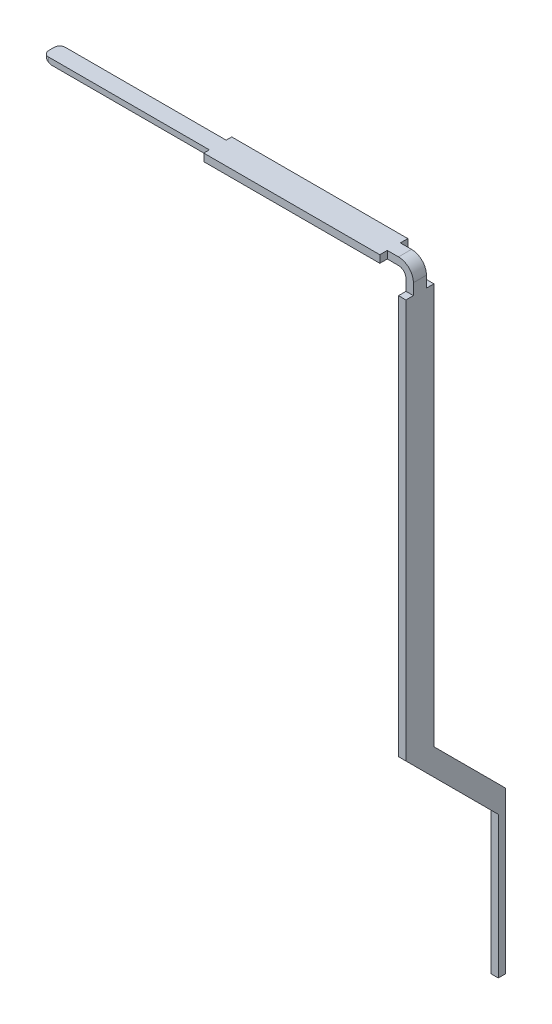
ISO-10303-21;
HEADER;
FILE_DESCRIPTION(('STEP AP214'),'2;1');
FILE_NAME('part.step','',(''),(''),'','','');
FILE_SCHEMA(('AUTOMOTIVE_DESIGN { 1 0 10303 214 1 1 1 1 }'));
ENDSEC;
DATA;
#1=APPLICATION_CONTEXT('core data for automotive mechanical design processes');
#2=APPLICATION_PROTOCOL_DEFINITION('international standard','automotive_design',2000,#1);
#3=PRODUCT_CONTEXT('',#1,'mechanical');
#4=PRODUCT('Part','Part','',(#3));
#5=PRODUCT_RELATED_PRODUCT_CATEGORY('part','',(#4));
#6=PRODUCT_DEFINITION_FORMATION('','',#4);
#7=PRODUCT_DEFINITION_CONTEXT('part definition',#1,'design');
#8=PRODUCT_DEFINITION('design','',#6,#7);
#9=PRODUCT_DEFINITION_SHAPE('','',#8);
#10=(LENGTH_UNIT() NAMED_UNIT(*) SI_UNIT(.MILLI.,.METRE.));
#11=(NAMED_UNIT(*) PLANE_ANGLE_UNIT() SI_UNIT($,.RADIAN.));
#12=(NAMED_UNIT(*) SI_UNIT($,.STERADIAN.) SOLID_ANGLE_UNIT());
#13=UNCERTAINTY_MEASURE_WITH_UNIT(LENGTH_MEASURE(1.E-05),#10,'distance_accuracy_value','');
#14=(GEOMETRIC_REPRESENTATION_CONTEXT(3) GLOBAL_UNCERTAINTY_ASSIGNED_CONTEXT((#13)) GLOBAL_UNIT_ASSIGNED_CONTEXT((#10,
#11,#12)) REPRESENTATION_CONTEXT('',''));
#15=CARTESIAN_POINT('',(0.,0.,0.));
#16=DIRECTION('',(0.,0.,1.));
#17=DIRECTION('',(1.,0.,0.));
#18=AXIS2_PLACEMENT_3D('',#15,#16,#17);
#19=CARTESIAN_POINT('',(7.71,11.7056,-3.5715));
#20=DIRECTION('',(1.,0.,0.));
#21=DIRECTION('',(0.,1.,0.));
#22=AXIS2_PLACEMENT_3D('',#19,#20,#21);
#23=PLANE('',#22);
#24=DIRECTION('',(0.,1.,0.));
#25=VECTOR('',#24,1.);
#26=CARTESIAN_POINT('',(7.71,11.7056,-4.37499999999994));
#27=LINE('',#26,#25);
#28=CARTESIAN_POINT('',(7.71,0.31210678118785,-4.37499999999953));
#29=VERTEX_POINT('',#28);
#30=CARTESIAN_POINT('',(7.71,11.060000000001,-4.375));
#31=VERTEX_POINT('',#30);
#32=EDGE_CURVE('E11',#29,#31,#27,.T.);
#33=ORIENTED_EDGE('',*,*,#32,.T.);
#34=DIRECTION('',(0.,0.,1.));
#35=VECTOR('',#34,1.);
#36=CARTESIAN_POINT('',(7.71,11.06,-3.5715));
#37=LINE('',#36,#35);
#38=CARTESIAN_POINT('',(7.71,11.06,-4.175));
#39=VERTEX_POINT('',#38);
#40=EDGE_CURVE('E27',#31,#39,#37,.T.);
#41=ORIENTED_EDGE('',*,*,#40,.T.);
#42=DIRECTION('',(0.,1.,0.));
#43=VECTOR('',#42,1.);
#44=CARTESIAN_POINT('',(7.71,11.7056,-4.175));
#45=LINE('',#44,#43);
#46=CARTESIAN_POINT('',(7.71,11.359999999999,-4.17500000000005));
#47=VERTEX_POINT('',#46);
#48=EDGE_CURVE('E420',#39,#47,#45,.T.);
#49=ORIENTED_EDGE('',*,*,#48,.T.);
#50=DIRECTION('',(0.,0.,1.));
#51=VECTOR('',#50,1.);
#52=CARTESIAN_POINT('',(7.71,11.3599999999979,-3.5715));
#53=LINE('',#52,#51);
#54=CARTESIAN_POINT('',(7.71,11.359999999999,-3.82499999999995));
#55=VERTEX_POINT('',#54);
#56=EDGE_CURVE('E416',#47,#55,#53,.T.);
#57=ORIENTED_EDGE('',*,*,#56,.T.);
#58=DIRECTION('',(0.,-1.,0.));
#59=VECTOR('',#58,1.);
#60=CARTESIAN_POINT('',(7.71,11.7056,-3.82499999999995));
#61=LINE('',#60,#59);
#62=CARTESIAN_POINT('',(7.71,11.0600000000005,-3.825));
#63=VERTEX_POINT('',#62);
#64=EDGE_CURVE('E421',#55,#63,#61,.T.);
#65=ORIENTED_EDGE('',*,*,#64,.T.);
#66=DIRECTION('',(0.,0.,1.));
#67=VECTOR('',#66,1.);
#68=CARTESIAN_POINT('',(7.71,11.060000000001,-3.5715));
#69=LINE('',#68,#67);
#70=CARTESIAN_POINT('',(7.71,11.0600000000003,-3.625));
#71=VERTEX_POINT('',#70);
#72=EDGE_CURVE('E437',#63,#71,#69,.T.);
#73=ORIENTED_EDGE('',*,*,#72,.T.);
#74=DIRECTION('',(0.,-1.,0.));
#75=VECTOR('',#74,1.);
#76=CARTESIAN_POINT('',(7.71,11.7056,-3.625));
#77=LINE('',#76,#75);
#78=CARTESIAN_POINT('',(7.71,0.355000000000092,-3.62499999999995));
#79=VERTEX_POINT('',#78);
#80=EDGE_CURVE('E20',#71,#79,#77,.T.);
#81=ORIENTED_EDGE('',*,*,#80,.T.);
#82=DIRECTION('',(0.,-0.707106781186548,-0.707106781186548));
#83=VECTOR('',#82,1.);
#84=CARTESIAN_POINT('',(7.71,0.355000000000083,-3.62499999999992));
#85=LINE('',#84,#83);
#86=CARTESIAN_POINT('',(7.71,-2.12000000000008,-6.1));
#87=VERTEX_POINT('',#86);
#88=EDGE_CURVE('E282',#79,#87,#85,.T.);
#89=ORIENTED_EDGE('',*,*,#88,.T.);
#90=DIRECTION('',(0.,-1.,0.));
#91=VECTOR('',#90,1.);
#92=CARTESIAN_POINT('',(7.71,11.7056,-6.10000000000008));
#93=LINE('',#92,#91);
#94=CARTESIAN_POINT('',(7.71,-5.92,-6.1));
#95=VERTEX_POINT('',#94);
#96=EDGE_CURVE('E271',#87,#95,#93,.T.);
#97=ORIENTED_EDGE('',*,*,#96,.T.);
#98=DIRECTION('',(0.,0.,-1.));
#99=VECTOR('',#98,1.);
#100=CARTESIAN_POINT('',(7.71,-5.92,-3.5715));
#101=LINE('',#100,#99);
#102=CARTESIAN_POINT('',(7.71,-5.92,-6.3));
#103=VERTEX_POINT('',#102);
#104=EDGE_CURVE('E384',#95,#103,#101,.T.);
#105=ORIENTED_EDGE('',*,*,#104,.T.);
#106=DIRECTION('',(0.,1.,0.));
#107=VECTOR('',#106,1.);
#108=CARTESIAN_POINT('',(7.71,11.7056,-6.3));
#109=LINE('',#108,#107);
#110=CARTESIAN_POINT('',(7.71,-1.61289321881287,-6.3));
#111=VERTEX_POINT('',#110);
#112=EDGE_CURVE('E380',#103,#111,#109,.T.);
#113=ORIENTED_EDGE('',*,*,#112,.T.);
#114=DIRECTION('',(0.,0.707106781186725,0.70710678118637));
#115=VECTOR('',#114,1.);
#116=CARTESIAN_POINT('',(7.71,-1.61289321881282,-6.3));
#117=LINE('',#116,#115);
#118=EDGE_CURVE('E318',#111,#29,#117,.T.);
#119=ORIENTED_EDGE('',*,*,#118,.T.);
#120=EDGE_LOOP('',(#33,#41,#49,#57,#65,#73,#81,#89,#97,#105,#113,#119));
#121=FACE_BOUND('',#120,.T.);
#122=ADVANCED_FACE('F16',(#121),#23,.T.);
#123=CARTESIAN_POINT('',(7.735730373025,11.06,-4.149269626975));
#124=DIRECTION('',(0.,1.,0.));
#125=DIRECTION('',(1.,0.,0.));
#126=AXIS2_PLACEMENT_3D('',#123,#124,#125);
#127=PLANE('',#126);
#128=DIRECTION('',(0.,0.,1.));
#129=VECTOR('',#128,1.);
#130=CARTESIAN_POINT('',(7.51,11.060000000002,-3.5715));
#131=LINE('',#130,#129);
#132=CARTESIAN_POINT('',(7.51,11.060000000002,-4.375));
#133=VERTEX_POINT('',#132);
#134=CARTESIAN_POINT('',(7.51,11.0600000000011,-4.175));
#135=VERTEX_POINT('',#134);
#136=EDGE_CURVE('E303',#133,#135,#131,.T.);
#137=ORIENTED_EDGE('',*,*,#136,.T.);
#138=DIRECTION('',(1.,0.,0.));
#139=VECTOR('',#138,1.);
#140=CARTESIAN_POINT('',(7.735730373025,11.06,-4.175));
#141=LINE('',#140,#139);
#142=EDGE_CURVE('E294',#135,#39,#141,.T.);
#143=ORIENTED_EDGE('',*,*,#142,.T.);
#144=ORIENTED_EDGE('',*,*,#40,.F.);
#145=DIRECTION('',(-1.,0.,0.));
#146=VECTOR('',#145,1.);
#147=CARTESIAN_POINT('',(7.735730373025,11.06,-4.375));
#148=LINE('',#147,#146);
#149=EDGE_CURVE('E300',#31,#133,#148,.T.);
#150=ORIENTED_EDGE('',*,*,#149,.T.);
#151=EDGE_LOOP('',(#137,#143,#144,#150));
#152=FACE_BOUND('',#151,.T.);
#153=ADVANCED_FACE('F302',(#152),#127,.T.);
#154=CARTESIAN_POINT('',(7.735730373025,11.27495786438,-4.375));
#155=DIRECTION('',(0.,0.,-1.));
#156=DIRECTION('',(0.,-1.,0.));
#157=AXIS2_PLACEMENT_3D('',#154,#155,#156);
#158=PLANE('',#157);
#159=ORIENTED_EDGE('',*,*,#149,.F.);
#160=ORIENTED_EDGE('',*,*,#32,.F.);
#161=DIRECTION('',(-1.,0.,0.));
#162=VECTOR('',#161,1.);
#163=CARTESIAN_POINT('',(7.735730373025,0.312106781188277,-4.375));
#164=LINE('',#163,#162);
#165=CARTESIAN_POINT('',(7.51,0.312106781187388,-4.37499999999954));
#166=VERTEX_POINT('',#165);
#167=EDGE_CURVE('E309',#29,#166,#164,.T.);
#168=ORIENTED_EDGE('',*,*,#167,.T.);
#169=DIRECTION('',(0.,1.,0.));
#170=VECTOR('',#169,1.);
#171=CARTESIAN_POINT('',(7.51,11.27495786438,-4.375));
#172=LINE('',#171,#170);
#173=EDGE_CURVE('E313',#166,#133,#172,.T.);
#174=ORIENTED_EDGE('',*,*,#173,.T.);
#175=EDGE_LOOP('',(#159,#160,#168,#174));
#176=FACE_BOUND('',#175,.T.);
#177=ADVANCED_FACE('F320',(#176),#158,.T.);
#178=CARTESIAN_POINT('',(7.735730373025,-1.651393218813,-6.3385));
#179=DIRECTION('',(0.,-0.707106781186636,0.707106781186459));
#180=DIRECTION('',(-1.,0.,0.));
#181=AXIS2_PLACEMENT_3D('',#178,#179,#180);
#182=PLANE('',#181);
#183=DIRECTION('',(1.,0.,0.));
#184=VECTOR('',#183,1.);
#185=CARTESIAN_POINT('',(7.735730373025,-1.61289321881313,-6.30000000000012));
#186=LINE('',#185,#184);
#187=CARTESIAN_POINT('',(7.51,-1.61289321881299,-6.3));
#188=VERTEX_POINT('',#187);
#189=EDGE_CURVE('E324',#188,#111,#186,.T.);
#190=ORIENTED_EDGE('',*,*,#189,.F.);
#191=DIRECTION('',(0.,-0.707106781186459,-0.707106781186636));
#192=VECTOR('',#191,1.);
#193=CARTESIAN_POINT('',(7.51,-1.651393218813,-6.3385));
#194=LINE('',#193,#192);
#195=EDGE_CURVE('E385',#166,#188,#194,.T.);
#196=ORIENTED_EDGE('',*,*,#195,.F.);
#197=ORIENTED_EDGE('',*,*,#167,.F.);
#198=ORIENTED_EDGE('',*,*,#118,.F.);
#199=EDGE_LOOP('',(#190,#196,#197,#198));
#200=FACE_BOUND('',#199,.T.);
#201=ADVANCED_FACE('F1096',(#200),#182,.F.);
#202=CARTESIAN_POINT('',(7.735730373025,-6.006142135624,-6.3));
#203=DIRECTION('',(0.,0.,1.));
#204=DIRECTION('',(1.,0.,0.));
#205=AXIS2_PLACEMENT_3D('',#202,#203,#204);
#206=PLANE('',#205);
#207=DIRECTION('',(1.,0.,0.));
#208=VECTOR('',#207,1.);
#209=CARTESIAN_POINT('',(7.735730373025,-5.92,-6.3));
#210=LINE('',#209,#208);
#211=CARTESIAN_POINT('',(7.51,-5.92,-6.3));
#212=VERTEX_POINT('',#211);
#213=EDGE_CURVE('E333',#212,#103,#210,.T.);
#214=ORIENTED_EDGE('',*,*,#213,.F.);
#215=DIRECTION('',(0.,-1.,0.));
#216=VECTOR('',#215,1.);
#217=CARTESIAN_POINT('',(7.51,-6.006142135624,-6.3));
#218=LINE('',#217,#216);
#219=EDGE_CURVE('E388',#188,#212,#218,.T.);
#220=ORIENTED_EDGE('',*,*,#219,.F.);
#221=ORIENTED_EDGE('',*,*,#189,.T.);
#222=ORIENTED_EDGE('',*,*,#112,.F.);
#223=EDGE_LOOP('',(#214,#220,#221,#222));
#224=FACE_BOUND('',#223,.T.);
#225=ADVANCED_FACE('F1229',(#224),#206,.F.);
#226=CARTESIAN_POINT('',(7.735730373025,-5.92,-6.074269626975));
#227=DIRECTION('',(0.,1.,0.));
#228=DIRECTION('',(1.,0.,0.));
#229=AXIS2_PLACEMENT_3D('',#226,#227,#228);
#230=PLANE('',#229);
#231=ORIENTED_EDGE('',*,*,#104,.F.);
#232=DIRECTION('',(1.,0.,0.));
#233=VECTOR('',#232,1.);
#234=CARTESIAN_POINT('',(7.735730373025,-5.92,-6.1));
#235=LINE('',#234,#233);
#236=CARTESIAN_POINT('',(7.51,-5.92,-6.1));
#237=VERTEX_POINT('',#236);
#238=EDGE_CURVE('E358',#237,#95,#235,.T.);
#239=ORIENTED_EDGE('',*,*,#238,.F.);
#240=DIRECTION('',(0.,0.,1.));
#241=VECTOR('',#240,1.);
#242=CARTESIAN_POINT('',(7.51,-5.92,-6.074269626975));
#243=LINE('',#242,#241);
#244=EDGE_CURVE('E433',#212,#237,#243,.T.);
#245=ORIENTED_EDGE('',*,*,#244,.F.);
#246=ORIENTED_EDGE('',*,*,#213,.T.);
#247=EDGE_LOOP('',(#231,#239,#245,#246));
#248=FACE_BOUND('',#247,.T.);
#249=ADVANCED_FACE('F1224',(#248),#230,.F.);
#250=CARTESIAN_POINT('',(7.735730373025,-5.996,-6.1));
#251=DIRECTION('',(0.,0.,1.));
#252=DIRECTION('',(1.,0.,0.));
#253=AXIS2_PLACEMENT_3D('',#250,#251,#252);
#254=PLANE('',#253);
#255=DIRECTION('',(0.,-1.,0.));
#256=VECTOR('',#255,1.);
#257=CARTESIAN_POINT('',(7.51,-5.996,-6.1));
#258=LINE('',#257,#256);
#259=CARTESIAN_POINT('',(7.51,-2.12000000000006,-6.1));
#260=VERTEX_POINT('',#259);
#261=EDGE_CURVE('E379',#260,#237,#258,.T.);
#262=ORIENTED_EDGE('',*,*,#261,.T.);
#263=ORIENTED_EDGE('',*,*,#238,.T.);
#264=ORIENTED_EDGE('',*,*,#96,.F.);
#265=DIRECTION('',(-1.,0.,0.));
#266=VECTOR('',#265,1.);
#267=CARTESIAN_POINT('',(7.735730373025,-2.12000000000008,-6.1));
#268=LINE('',#267,#266);
#269=EDGE_CURVE('E355',#87,#260,#268,.T.);
#270=ORIENTED_EDGE('',*,*,#269,.T.);
#271=EDGE_LOOP('',(#262,#263,#264,#270));
#272=FACE_BOUND('',#271,.T.);
#273=ADVANCED_FACE('F1228',(#272),#254,.T.);
#274=CARTESIAN_POINT('',(7.735730373025,0.4045,-3.5755));
#275=DIRECTION('',(0.,0.707106781186547,-0.707106781186548));
#276=DIRECTION('',(-1.,0.,0.));
#277=AXIS2_PLACEMENT_3D('',#274,#275,#276);
#278=PLANE('',#277);
#279=DIRECTION('',(1.,0.,0.));
#280=VECTOR('',#279,1.);
#281=CARTESIAN_POINT('',(7.735730373025,0.355000000000164,-3.62499999999983));
#282=LINE('',#281,#280);
#283=CARTESIAN_POINT('',(7.51,0.355000000000083,-3.62499999999994));
#284=VERTEX_POINT('',#283);
#285=EDGE_CURVE('E359',#284,#79,#282,.T.);
#286=ORIENTED_EDGE('',*,*,#285,.F.);
#287=DIRECTION('',(0.,0.707106781186548,0.707106781186547));
#288=VECTOR('',#287,1.);
#289=CARTESIAN_POINT('',(7.51,0.4045,-3.5755));
#290=LINE('',#289,#288);
#291=EDGE_CURVE('E353',#260,#284,#290,.T.);
#292=ORIENTED_EDGE('',*,*,#291,.F.);
#293=ORIENTED_EDGE('',*,*,#269,.F.);
#294=ORIENTED_EDGE('',*,*,#88,.F.);
#295=EDGE_LOOP('',(#286,#292,#293,#294));
#296=FACE_BOUND('',#295,.T.);
#297=ADVANCED_FACE('F18',(#296),#278,.F.);
#298=CARTESIAN_POINT('',(7.735730373025,11.2741,-3.625));
#299=DIRECTION('',(0.,0.,-1.));
#300=DIRECTION('',(0.,-1.,0.));
#301=AXIS2_PLACEMENT_3D('',#298,#299,#300);
#302=PLANE('',#301);
#303=ORIENTED_EDGE('',*,*,#80,.F.);
#304=DIRECTION('',(1.,0.,0.));
#305=VECTOR('',#304,1.);
#306=CARTESIAN_POINT('',(7.735730373025,11.06,-3.625));
#307=LINE('',#306,#305);
#308=CARTESIAN_POINT('',(7.51,11.060000000001,-3.625));
#309=VERTEX_POINT('',#308);
#310=EDGE_CURVE('E467',#309,#71,#307,.T.);
#311=ORIENTED_EDGE('',*,*,#310,.F.);
#312=DIRECTION('',(0.,1.,0.));
#313=VECTOR('',#312,1.);
#314=CARTESIAN_POINT('',(7.51,11.2741,-3.625));
#315=LINE('',#314,#313);
#316=EDGE_CURVE('E350',#284,#309,#315,.T.);
#317=ORIENTED_EDGE('',*,*,#316,.F.);
#318=ORIENTED_EDGE('',*,*,#285,.T.);
#319=EDGE_LOOP('',(#303,#311,#317,#318));
#320=FACE_BOUND('',#319,.T.);
#321=ADVANCED_FACE('F1076',(#320),#302,.F.);
#322=CARTESIAN_POINT('',(7.735730373025,11.06,-3.599269626975));
#323=DIRECTION('',(0.,1.,0.));
#324=DIRECTION('',(1.,0.,0.));
#325=AXIS2_PLACEMENT_3D('',#322,#323,#324);
#326=PLANE('',#325);
#327=DIRECTION('',(0.,0.,1.));
#328=VECTOR('',#327,1.);
#329=CARTESIAN_POINT('',(7.51,11.06,-3.599269626975));
#330=LINE('',#329,#328);
#331=CARTESIAN_POINT('',(7.51,11.0600000000003,-3.825));
#332=VERTEX_POINT('',#331);
#333=EDGE_CURVE('E471',#332,#309,#330,.T.);
#334=ORIENTED_EDGE('',*,*,#333,.T.);
#335=ORIENTED_EDGE('',*,*,#310,.T.);
#336=ORIENTED_EDGE('',*,*,#72,.F.);
#337=DIRECTION('',(-1.,0.,0.));
#338=VECTOR('',#337,1.);
#339=CARTESIAN_POINT('',(7.735730373025,11.06,-3.825));
#340=LINE('',#339,#338);
#341=EDGE_CURVE('E472',#63,#332,#340,.T.);
#342=ORIENTED_EDGE('',*,*,#341,.T.);
#343=EDGE_LOOP('',(#334,#335,#336,#342));
#344=FACE_BOUND('',#343,.T.);
#345=ADVANCED_FACE('F1072',(#344),#326,.T.);
#346=CARTESIAN_POINT('',(7.735730373025,11.38573037302,-3.825));
#347=DIRECTION('',(0.,0.,-1.));
#348=DIRECTION('',(0.,-1.,0.));
#349=AXIS2_PLACEMENT_3D('',#346,#347,#348);
#350=PLANE('',#349);
#351=CARTESIAN_POINT('',(7.31,11.36,-3.82499999999995));
#352=DIRECTION('',(0.,0.,-1.));
#353=DIRECTION('',(-1.,0.,0.));
#354=AXIS2_PLACEMENT_3D('',#351,#352,#353);
#355=CIRCLE('',#354,0.4);
#356=CARTESIAN_POINT('',(7.31,11.7599999999987,-3.82499999999995));
#357=VERTEX_POINT('',#356);
#358=EDGE_CURVE('E449',#357,#55,#355,.T.);
#359=ORIENTED_EDGE('',*,*,#358,.F.);
#360=DIRECTION('',(1.,0.,0.));
#361=VECTOR('',#360,1.);
#362=CARTESIAN_POINT('',(7.735730373025,11.7599999999974,-3.825));
#363=LINE('',#362,#361);
#364=CARTESIAN_POINT('',(7.01,11.7599999999983,-3.825));
#365=VERTEX_POINT('',#364);
#366=EDGE_CURVE('E494',#365,#357,#363,.T.);
#367=ORIENTED_EDGE('',*,*,#366,.F.);
#368=DIRECTION('',(0.,1.,0.));
#369=VECTOR('',#368,1.);
#370=CARTESIAN_POINT('',(7.01,11.38573037302,-3.825));
#371=LINE('',#370,#369);
#372=CARTESIAN_POINT('',(7.01,11.56,-3.825));
#373=VERTEX_POINT('',#372);
#374=EDGE_CURVE('E349',#373,#365,#371,.T.);
#375=ORIENTED_EDGE('',*,*,#374,.F.);
#376=DIRECTION('',(1.,0.,0.));
#377=VECTOR('',#376,1.);
#378=CARTESIAN_POINT('',(4.2806,11.56,-3.825));
#379=LINE('',#378,#377);
#380=CARTESIAN_POINT('',(7.31,11.56,-3.825));
#381=VERTEX_POINT('',#380);
#382=EDGE_CURVE('E486',#373,#381,#379,.T.);
#383=ORIENTED_EDGE('',*,*,#382,.T.);
#384=CARTESIAN_POINT('',(7.31,11.36,-3.825));
#385=DIRECTION('',(0.,0.,1.));
#386=DIRECTION('',(-1.,0.,0.));
#387=AXIS2_PLACEMENT_3D('',#384,#385,#386);
#388=CIRCLE('',#387,0.2);
#389=CARTESIAN_POINT('',(7.51,11.359999999999,-3.825));
#390=VERTEX_POINT('',#389);
#391=EDGE_CURVE('E337',#390,#381,#388,.T.);
#392=ORIENTED_EDGE('',*,*,#391,.F.);
#393=DIRECTION('',(0.,1.,0.));
#394=VECTOR('',#393,1.);
#395=CARTESIAN_POINT('',(7.51,11.38573037302,-3.825));
#396=LINE('',#395,#394);
#397=EDGE_CURVE('E354',#332,#390,#396,.T.);
#398=ORIENTED_EDGE('',*,*,#397,.F.);
#399=ORIENTED_EDGE('',*,*,#341,.F.);
#400=ORIENTED_EDGE('',*,*,#64,.F.);
#401=EDGE_LOOP('',(#359,#367,#375,#383,#392,#398,#399,#400));
#402=FACE_BOUND('',#401,.T.);
#403=ADVANCED_FACE('F670',(#402),#350,.F.);
#404=CARTESIAN_POINT('',(7.31,11.36,-3.8249999999999));
#405=DIRECTION('',(0.,0.,-1.));
#406=DIRECTION('',(-1.,0.,0.));
#407=AXIS2_PLACEMENT_3D('',#404,#405,#406);
#408=CYLINDRICAL_SURFACE('',#407,0.4);
#409=ORIENTED_EDGE('',*,*,#358,.T.);
#410=ORIENTED_EDGE('',*,*,#56,.F.);
#411=CARTESIAN_POINT('',(7.31,11.36,-4.17500000000009));
#412=DIRECTION('',(0.,0.,1.));
#413=DIRECTION('',(-1.,0.,0.));
#414=AXIS2_PLACEMENT_3D('',#411,#412,#413);
#415=CIRCLE('',#414,0.4);
#416=CARTESIAN_POINT('',(7.31,11.7599999999987,-4.17500000000009));
#417=VERTEX_POINT('',#416);
#418=EDGE_CURVE('E375',#47,#417,#415,.T.);
#419=ORIENTED_EDGE('',*,*,#418,.T.);
#420=DIRECTION('',(0.,0.,1.));
#421=VECTOR('',#420,1.);
#422=CARTESIAN_POINT('',(7.31,11.76,-3.8249999999999));
#423=LINE('',#422,#421);
#424=EDGE_CURVE('E371',#417,#357,#423,.T.);
#425=ORIENTED_EDGE('',*,*,#424,.T.);
#426=EDGE_LOOP('',(#409,#410,#419,#425));
#427=FACE_BOUND('',#426,.T.);
#428=ADVANCED_FACE('F1112',(#427),#408,.T.);
#429=CARTESIAN_POINT('',(7.735730373025,11.38573037302,-4.175));
#430=DIRECTION('',(0.,0.,-1.));
#431=DIRECTION('',(0.,-1.,0.));
#432=AXIS2_PLACEMENT_3D('',#429,#430,#431);
#433=PLANE('',#432);
#434=DIRECTION('',(1.,0.,0.));
#435=VECTOR('',#434,1.);
#436=CARTESIAN_POINT('',(7.735730373025,11.7599999999974,-4.175));
#437=LINE('',#436,#435);
#438=CARTESIAN_POINT('',(7.01,11.7599999999983,-4.175));
#439=VERTEX_POINT('',#438);
#440=EDGE_CURVE('E376',#439,#417,#437,.T.);
#441=ORIENTED_EDGE('',*,*,#440,.T.);
#442=ORIENTED_EDGE('',*,*,#418,.F.);
#443=ORIENTED_EDGE('',*,*,#48,.F.);
#444=ORIENTED_EDGE('',*,*,#142,.F.);
#445=DIRECTION('',(0.,1.,0.));
#446=VECTOR('',#445,1.);
#447=CARTESIAN_POINT('',(7.51,11.38573037302,-4.175));
#448=LINE('',#447,#446);
#449=CARTESIAN_POINT('',(7.51,11.359999999999,-4.17500000000005));
#450=VERTEX_POINT('',#449);
#451=EDGE_CURVE('E316',#135,#450,#448,.T.);
#452=ORIENTED_EDGE('',*,*,#451,.T.);
#453=CARTESIAN_POINT('',(7.31,11.36,-4.17500000000009));
#454=DIRECTION('',(0.,0.,1.));
#455=DIRECTION('',(-1.,0.,0.));
#456=AXIS2_PLACEMENT_3D('',#453,#454,#455);
#457=CIRCLE('',#456,0.2);
#458=CARTESIAN_POINT('',(7.31,11.56,-4.17500000000008));
#459=VERTEX_POINT('',#458);
#460=EDGE_CURVE('E339',#450,#459,#457,.T.);
#461=ORIENTED_EDGE('',*,*,#460,.T.);
#462=DIRECTION('',(-1.,0.,0.));
#463=VECTOR('',#462,1.);
#464=CARTESIAN_POINT('',(4.2806,11.56,-4.17500000000006));
#465=LINE('',#464,#463);
#466=CARTESIAN_POINT('',(7.01,11.56,-4.175));
#467=VERTEX_POINT('',#466);
#468=EDGE_CURVE('E343',#459,#467,#465,.T.);
#469=ORIENTED_EDGE('',*,*,#468,.T.);
#470=DIRECTION('',(0.,1.,0.));
#471=VECTOR('',#470,1.);
#472=CARTESIAN_POINT('',(7.01,11.38573037302,-4.175));
#473=LINE('',#472,#471);
#474=EDGE_CURVE('E387',#467,#439,#473,.T.);
#475=ORIENTED_EDGE('',*,*,#474,.T.);
#476=EDGE_LOOP('',(#441,#442,#443,#444,#452,#461,#469,#475));
#477=FACE_BOUND('',#476,.T.);
#478=ADVANCED_FACE('F692',(#477),#433,.T.);
#479=CARTESIAN_POINT('',(7.51,11.7056,-3.5715));
#480=DIRECTION('',(1.,0.,0.));
#481=DIRECTION('',(0.,1.,0.));
#482=AXIS2_PLACEMENT_3D('',#479,#480,#481);
#483=PLANE('',#482);
#484=ORIENTED_EDGE('',*,*,#136,.F.);
#485=ORIENTED_EDGE('',*,*,#173,.F.);
#486=ORIENTED_EDGE('',*,*,#195,.T.);
#487=ORIENTED_EDGE('',*,*,#219,.T.);
#488=ORIENTED_EDGE('',*,*,#244,.T.);
#489=ORIENTED_EDGE('',*,*,#261,.F.);
#490=ORIENTED_EDGE('',*,*,#291,.T.);
#491=ORIENTED_EDGE('',*,*,#316,.T.);
#492=ORIENTED_EDGE('',*,*,#333,.F.);
#493=ORIENTED_EDGE('',*,*,#397,.T.);
#494=DIRECTION('',(0.,0.,1.));
#495=VECTOR('',#494,1.);
#496=CARTESIAN_POINT('',(7.51,11.3599999999979,-3.5715));
#497=LINE('',#496,#495);
#498=EDGE_CURVE('E444',#450,#390,#497,.T.);
#499=ORIENTED_EDGE('',*,*,#498,.F.);
#500=ORIENTED_EDGE('',*,*,#451,.F.);
#501=EDGE_LOOP('',(#484,#485,#486,#487,#488,#489,#490,#491,#492,#493,#499,#500));
#502=FACE_BOUND('',#501,.T.);
#503=ADVANCED_FACE('F312',(#502),#483,.F.);
#504=CARTESIAN_POINT('',(4.2806,11.76,-3.599269626975));
#505=DIRECTION('',(0.,1.,0.));
#506=DIRECTION('',(1.,0.,0.));
#507=AXIS2_PLACEMENT_3D('',#504,#505,#506);
#508=PLANE('',#507);
#509=DIRECTION('',(1.,0.,0.));
#510=VECTOR('',#509,1.);
#511=CARTESIAN_POINT('',(4.2806,11.76,-3.775));
#512=LINE('',#511,#510);
#513=CARTESIAN_POINT('',(-2.02,11.7599999999989,-3.775));
#514=VERTEX_POINT('',#513);
#515=CARTESIAN_POINT('',(2.29,11.76,-3.775));
#516=VERTEX_POINT('',#515);
#517=EDGE_CURVE('E391',#514,#516,#512,.T.);
#518=ORIENTED_EDGE('',*,*,#517,.T.);
#519=DIRECTION('',(0.,0.,1.));
#520=VECTOR('',#519,1.);
#521=CARTESIAN_POINT('',(2.29,11.76,-3.599269626975));
#522=LINE('',#521,#520);
#523=CARTESIAN_POINT('',(2.29,11.76,-3.62499999999992));
#524=VERTEX_POINT('',#523);
#525=EDGE_CURVE('E399',#516,#524,#522,.T.);
#526=ORIENTED_EDGE('',*,*,#525,.T.);
#527=DIRECTION('',(1.,0.,0.));
#528=VECTOR('',#527,1.);
#529=CARTESIAN_POINT('',(4.2806,11.76,-3.62499999999991));
#530=LINE('',#529,#528);
#531=CARTESIAN_POINT('',(7.01,11.76,-3.62499999999992));
#532=VERTEX_POINT('',#531);
#533=EDGE_CURVE('E408',#524,#532,#530,.T.);
#534=ORIENTED_EDGE('',*,*,#533,.T.);
#535=DIRECTION('',(0.,0.,-1.));
#536=VECTOR('',#535,1.);
#537=CARTESIAN_POINT('',(7.01,11.76,-3.599269626975));
#538=LINE('',#537,#536);
#539=EDGE_CURVE('E187',#532,#365,#538,.T.);
#540=ORIENTED_EDGE('',*,*,#539,.T.);
#541=ORIENTED_EDGE('',*,*,#366,.T.);
#542=ORIENTED_EDGE('',*,*,#424,.F.);
#543=ORIENTED_EDGE('',*,*,#440,.F.);
#544=DIRECTION('',(0.,0.,-1.));
#545=VECTOR('',#544,1.);
#546=CARTESIAN_POINT('',(7.01,11.76,-3.599269626975));
#547=LINE('',#546,#545);
#548=CARTESIAN_POINT('',(7.01,11.7599999999991,-4.37500000000009));
#549=VERTEX_POINT('',#548);
#550=EDGE_CURVE('E497',#439,#549,#547,.T.);
#551=ORIENTED_EDGE('',*,*,#550,.T.);
#552=DIRECTION('',(-1.,0.,0.));
#553=VECTOR('',#552,1.);
#554=CARTESIAN_POINT('',(4.2806,11.76,-4.37500000000009));
#555=LINE('',#554,#553);
#556=CARTESIAN_POINT('',(2.29,11.76,-4.37500000000006));
#557=VERTEX_POINT('',#556);
#558=EDGE_CURVE('E204',#549,#557,#555,.T.);
#559=ORIENTED_EDGE('',*,*,#558,.T.);
#560=DIRECTION('',(0.,0.,1.));
#561=VECTOR('',#560,1.);
#562=CARTESIAN_POINT('',(2.29,11.76,-3.599269626975));
#563=LINE('',#562,#561);
#564=CARTESIAN_POINT('',(2.29,11.76,-4.225));
#565=VERTEX_POINT('',#564);
#566=EDGE_CURVE('E502',#557,#565,#563,.T.);
#567=ORIENTED_EDGE('',*,*,#566,.T.);
#568=DIRECTION('',(-1.,0.,0.));
#569=VECTOR('',#568,1.);
#570=CARTESIAN_POINT('',(4.2806,11.76,-4.225));
#571=LINE('',#570,#569);
#572=CARTESIAN_POINT('',(-2.02,11.7599999999989,-4.225));
#573=VERTEX_POINT('',#572);
#574=EDGE_CURVE('E557',#565,#573,#571,.T.);
#575=ORIENTED_EDGE('',*,*,#574,.T.);
#576=CARTESIAN_POINT('',(-2.02,11.7599999999978,-4.075));
#577=DIRECTION('',(0.,1.,0.));
#578=DIRECTION('',(0.,0.,-1.));
#579=AXIS2_PLACEMENT_3D('',#576,#577,#578);
#580=CIRCLE('',#579,0.15);
#581=CARTESIAN_POINT('',(-2.17,11.7599999999989,-4.075));
#582=VERTEX_POINT('',#581);
#583=EDGE_CURVE('E566',#573,#582,#580,.T.);
#584=ORIENTED_EDGE('',*,*,#583,.T.);
#585=DIRECTION('',(0.,0.,1.));
#586=VECTOR('',#585,1.);
#587=CARTESIAN_POINT('',(-2.17,11.76,-3.599269626975));
#588=LINE('',#587,#586);
#589=CARTESIAN_POINT('',(-2.17,11.7599999999989,-3.925));
#590=VERTEX_POINT('',#589);
#591=EDGE_CURVE('E534',#582,#590,#588,.T.);
#592=ORIENTED_EDGE('',*,*,#591,.T.);
#593=CARTESIAN_POINT('',(-2.02,11.7599999999978,-3.925));
#594=DIRECTION('',(0.,1.,0.));
#595=DIRECTION('',(0.,0.,-1.));
#596=AXIS2_PLACEMENT_3D('',#593,#594,#595);
#597=CIRCLE('',#596,0.15);
#598=EDGE_CURVE('E348',#590,#514,#597,.T.);
#599=ORIENTED_EDGE('',*,*,#598,.T.);
#600=EDGE_LOOP('',(#518,#526,#534,#540,#541,#542,#543,#551,#559,#567,#575,#584,#592,#599));
#601=FACE_BOUND('',#600,.T.);
#602=ADVANCED_FACE('F671',(#601),#508,.T.);
#603=CARTESIAN_POINT('',(7.01,11.78573037302,-3.599269626975));
#604=DIRECTION('',(-1.,0.,0.));
#605=DIRECTION('',(0.,0.,1.));
#606=AXIS2_PLACEMENT_3D('',#603,#604,#605);
#607=PLANE('',#606);
#608=DIRECTION('',(0.,1.,0.));
#609=VECTOR('',#608,1.);
#610=CARTESIAN_POINT('',(7.01,11.78573037302,-3.62499999999994));
#611=LINE('',#610,#609);
#612=CARTESIAN_POINT('',(7.01,11.5600000000013,-3.62499999999995));
#613=VERTEX_POINT('',#612);
#614=EDGE_CURVE('E523',#613,#532,#611,.T.);
#615=ORIENTED_EDGE('',*,*,#614,.F.);
#616=DIRECTION('',(0.,0.,-1.));
#617=VECTOR('',#616,1.);
#618=CARTESIAN_POINT('',(7.01,11.56,-3.599269626975));
#619=LINE('',#618,#617);
#620=EDGE_CURVE('E344',#613,#373,#619,.T.);
#621=ORIENTED_EDGE('',*,*,#620,.T.);
#622=ORIENTED_EDGE('',*,*,#374,.T.);
#623=ORIENTED_EDGE('',*,*,#539,.F.);
#624=EDGE_LOOP('',(#615,#621,#622,#623));
#625=FACE_BOUND('',#624,.T.);
#626=ADVANCED_FACE('F666',(#625),#607,.F.);
#627=CARTESIAN_POINT('',(7.31,11.36,-3.8249999999999));
#628=DIRECTION('',(0.,0.,-1.));
#629=DIRECTION('',(-1.,0.,0.));
#630=AXIS2_PLACEMENT_3D('',#627,#628,#629);
#631=CYLINDRICAL_SURFACE('',#630,0.2);
#632=ORIENTED_EDGE('',*,*,#498,.T.);
#633=ORIENTED_EDGE('',*,*,#391,.T.);
#634=DIRECTION('',(0.,0.,-1.));
#635=VECTOR('',#634,1.);
#636=CARTESIAN_POINT('',(7.31,11.56,-3.599269626975));
#637=LINE('',#636,#635);
#638=EDGE_CURVE('E364',#381,#459,#637,.T.);
#639=ORIENTED_EDGE('',*,*,#638,.T.);
#640=ORIENTED_EDGE('',*,*,#460,.F.);
#641=EDGE_LOOP('',(#632,#633,#639,#640));
#642=FACE_BOUND('',#641,.T.);
#643=ADVANCED_FACE('F694',(#642),#631,.F.);
#644=CARTESIAN_POINT('',(7.01,11.78573037302,-4.149269626975));
#645=DIRECTION('',(-1.,0.,0.));
#646=DIRECTION('',(0.,0.,1.));
#647=AXIS2_PLACEMENT_3D('',#644,#645,#646);
#648=PLANE('',#647);
#649=ORIENTED_EDGE('',*,*,#474,.F.);
#650=DIRECTION('',(0.,0.,-1.));
#651=VECTOR('',#650,1.);
#652=CARTESIAN_POINT('',(7.01,11.56,-3.599269626975));
#653=LINE('',#652,#651);
#654=CARTESIAN_POINT('',(7.01,11.5600000000017,-4.37500000000005));
#655=VERTEX_POINT('',#654);
#656=EDGE_CURVE('E360',#467,#655,#653,.T.);
#657=ORIENTED_EDGE('',*,*,#656,.T.);
#658=DIRECTION('',(0.,-1.,0.));
#659=VECTOR('',#658,1.);
#660=CARTESIAN_POINT('',(7.01,11.78573037302,-4.37500000000009));
#661=LINE('',#660,#659);
#662=EDGE_CURVE('E370',#549,#655,#661,.T.);
#663=ORIENTED_EDGE('',*,*,#662,.F.);
#664=ORIENTED_EDGE('',*,*,#550,.F.);
#665=EDGE_LOOP('',(#649,#657,#663,#664));
#666=FACE_BOUND('',#665,.T.);
#667=ADVANCED_FACE('F690',(#666),#648,.F.);
#668=CARTESIAN_POINT('',(2.29,11.78573037302,-3.599269626975));
#669=DIRECTION('',(-1.,0.,0.));
#670=DIRECTION('',(0.,0.,1.));
#671=AXIS2_PLACEMENT_3D('',#668,#669,#670);
#672=PLANE('',#671);
#673=DIRECTION('',(0.,1.,0.));
#674=VECTOR('',#673,1.);
#675=CARTESIAN_POINT('',(2.29,11.78573037302,-3.62499999999993));
#676=LINE('',#675,#674);
#677=CARTESIAN_POINT('',(2.28999999999994,11.5600000000009,-3.62499999999995));
#678=VERTEX_POINT('',#677);
#679=EDGE_CURVE('E365',#678,#524,#676,.T.);
#680=ORIENTED_EDGE('',*,*,#679,.T.);
#681=ORIENTED_EDGE('',*,*,#525,.F.);
#682=DIRECTION('',(0.,-1.,0.));
#683=VECTOR('',#682,1.);
#684=CARTESIAN_POINT('',(2.29,11.78573037302,-3.775));
#685=LINE('',#684,#683);
#686=CARTESIAN_POINT('',(2.29,11.6100000000015,-3.77499999999992));
#687=VERTEX_POINT('',#686);
#688=EDGE_CURVE('E539',#516,#687,#685,.T.);
#689=ORIENTED_EDGE('',*,*,#688,.T.);
#690=DIRECTION('',(0.,0.707106781202907,0.707106781170188));
#691=VECTOR('',#690,1.);
#692=CARTESIAN_POINT('',(2.28999999999996,11.54180587875,-3.843194121248));
#693=LINE('',#692,#691);
#694=CARTESIAN_POINT('',(2.28999999999996,11.5599999999996,-3.82499999999964));
#695=VERTEX_POINT('',#694);
#696=EDGE_CURVE('E422',#695,#687,#693,.T.);
#697=ORIENTED_EDGE('',*,*,#696,.F.);
#698=DIRECTION('',(0.,0.,1.));
#699=VECTOR('',#698,1.);
#700=CARTESIAN_POINT('',(2.28999999999996,11.56,-3.599269626975));
#701=LINE('',#700,#699);
#702=EDGE_CURVE('E543',#695,#678,#701,.T.);
#703=ORIENTED_EDGE('',*,*,#702,.T.);
#704=EDGE_LOOP('',(#680,#681,#689,#697,#703));
#705=FACE_BOUND('',#704,.T.);
#706=ADVANCED_FACE('F673',(#705),#672,.T.);
#707=CARTESIAN_POINT('',(-2.1062,11.78573037302,-3.775));
#708=DIRECTION('',(0.,0.,-1.));
#709=DIRECTION('',(0.,-1.,0.));
#710=AXIS2_PLACEMENT_3D('',#707,#708,#709);
#711=PLANE('',#710);
#712=DIRECTION('',(0.,1.,0.));
#713=VECTOR('',#712,1.);
#714=CARTESIAN_POINT('',(-2.02,11.78573037302,-3.775));
#715=LINE('',#714,#713);
#716=CARTESIAN_POINT('',(-2.02,11.6400538512765,-3.775));
#717=VERTEX_POINT('',#716);
#718=EDGE_CURVE('E510',#717,#514,#715,.T.);
#719=ORIENTED_EDGE('',*,*,#718,.F.);
#720=DIRECTION('',(-0.906307787039848,0.42261826173384,0.));
#721=VECTOR('',#720,1.);
#722=CARTESIAN_POINT('',(-1.95554930794976,11.6100000000007,-3.775));
#723=LINE('',#722,#721);
#724=CARTESIAN_POINT('',(-1.95554930795138,11.6100000000015,-3.77499999999977));
#725=VERTEX_POINT('',#724);
#726=EDGE_CURVE('E462',#725,#717,#723,.T.);
#727=ORIENTED_EDGE('',*,*,#726,.F.);
#728=DIRECTION('',(-1.,0.,0.));
#729=VECTOR('',#728,1.);
#730=CARTESIAN_POINT('',(-2.1062,11.6100000000015,-3.775));
#731=LINE('',#730,#729);
#732=EDGE_CURVE('E426',#687,#725,#731,.T.);
#733=ORIENTED_EDGE('',*,*,#732,.F.);
#734=ORIENTED_EDGE('',*,*,#688,.F.);
#735=ORIENTED_EDGE('',*,*,#517,.F.);
#736=EDGE_LOOP('',(#719,#727,#733,#734,#735));
#737=FACE_BOUND('',#736,.T.);
#738=ADVANCED_FACE('F618',(#737),#711,.F.);
#739=CARTESIAN_POINT('',(-2.02,11.7599999999956,-3.925));
#740=DIRECTION('',(0.,-1.,0.));
#741=DIRECTION('',(0.,0.,-1.));
#742=AXIS2_PLACEMENT_3D('',#739,#740,#741);
#743=CYLINDRICAL_SURFACE('',#742,0.15);
#744=CARTESIAN_POINT('',(-2.17,11.7099999999984,-3.925));
#745=CARTESIAN_POINT('',(-2.16999999999998,11.7099999999984,-3.83713203435595));
#746=CARTESIAN_POINT('',(-2.10786796564403,11.6810273565621,-3.775));
#747=CARTESIAN_POINT('',(-2.02,11.6400538512765,-3.775));
#748=(BOUNDED_CURVE() B_SPLINE_CURVE(3,(#744,#745,#746,#747),.UNSPECIFIED.,.F.,
.F.) B_SPLINE_CURVE_WITH_KNOTS((4,4),(3.14159265358992,4.71238898038469),
.UNSPECIFIED.) CURVE() GEOMETRIC_REPRESENTATION_ITEM() RATIONAL_B_SPLINE_CURVE((1.,
0.804737854124395,0.804737854124395,1.)) REPRESENTATION_ITEM(''));
#749=CARTESIAN_POINT('',(-2.17,11.7099999999984,-3.925));
#750=VERTEX_POINT('',#749);
#751=EDGE_CURVE('E412',#750,#717,#748,.T.);
#752=ORIENTED_EDGE('',*,*,#751,.T.);
#753=ORIENTED_EDGE('',*,*,#718,.T.);
#754=ORIENTED_EDGE('',*,*,#598,.F.);
#755=DIRECTION('',(0.,-1.,0.));
#756=VECTOR('',#755,1.);
#757=CARTESIAN_POINT('',(-2.17,11.7599999999956,-3.925));
#758=LINE('',#757,#756);
#759=EDGE_CURVE('E514',#590,#750,#758,.T.);
#760=ORIENTED_EDGE('',*,*,#759,.T.);
#761=EDGE_LOOP('',(#752,#753,#754,#760));
#762=FACE_BOUND('',#761,.T.);
#763=ADVANCED_FACE('F674',(#762),#743,.T.);
#764=CARTESIAN_POINT('',(-2.17,11.78573037302,-3.899269626975));
#765=DIRECTION('',(-1.,0.,0.));
#766=DIRECTION('',(0.,0.,1.));
#767=AXIS2_PLACEMENT_3D('',#764,#765,#766);
#768=PLANE('',#767);
#769=DIRECTION('',(0.,0.,1.));
#770=VECTOR('',#769,1.);
#771=CARTESIAN_POINT('',(-2.17,11.7099999999985,-3.899269626975));
#772=LINE('',#771,#770);
#773=CARTESIAN_POINT('',(-2.17,11.7099999999984,-4.075));
#774=VERTEX_POINT('',#773);
#775=EDGE_CURVE('E515',#774,#750,#772,.T.);
#776=ORIENTED_EDGE('',*,*,#775,.T.);
#777=ORIENTED_EDGE('',*,*,#759,.F.);
#778=ORIENTED_EDGE('',*,*,#591,.F.);
#779=DIRECTION('',(0.,-1.,0.));
#780=VECTOR('',#779,1.);
#781=CARTESIAN_POINT('',(-2.17,11.78573037302,-4.075));
#782=LINE('',#781,#780);
#783=EDGE_CURVE('E519',#582,#774,#782,.T.);
#784=ORIENTED_EDGE('',*,*,#783,.T.);
#785=EDGE_LOOP('',(#776,#777,#778,#784));
#786=FACE_BOUND('',#785,.T.);
#787=ADVANCED_FACE('F627',(#786),#768,.T.);
#788=CARTESIAN_POINT('',(-2.02,11.7599999999956,-4.075));
#789=DIRECTION('',(0.,-1.,0.));
#790=DIRECTION('',(0.,0.,-1.));
#791=AXIS2_PLACEMENT_3D('',#788,#789,#790);
#792=CYLINDRICAL_SURFACE('',#791,0.15);
#793=CARTESIAN_POINT('',(-2.02,11.6400538512765,-4.225));
#794=CARTESIAN_POINT('',(-2.10786796564403,11.6810273565621,-4.225));
#795=CARTESIAN_POINT('',(-2.17,11.7099999999984,-4.16286796564403));
#796=CARTESIAN_POINT('',(-2.17,11.7099999999984,-4.075));
#797=(BOUNDED_CURVE() B_SPLINE_CURVE(3,(#793,#794,#795,#796),.UNSPECIFIED.,.F.,
.F.) B_SPLINE_CURVE_WITH_KNOTS((4,4),(1.5707963267949,3.1415926535898),
.UNSPECIFIED.) CURVE() GEOMETRIC_REPRESENTATION_ITEM() RATIONAL_B_SPLINE_CURVE((1.,
0.804737854124365,0.804737854124365,1.)) REPRESENTATION_ITEM(''));
#798=CARTESIAN_POINT('',(-2.02,11.6400538512765,-4.225));
#799=VERTEX_POINT('',#798);
#800=EDGE_CURVE('E522',#799,#774,#797,.T.);
#801=ORIENTED_EDGE('',*,*,#800,.T.);
#802=ORIENTED_EDGE('',*,*,#783,.F.);
#803=ORIENTED_EDGE('',*,*,#583,.F.);
#804=DIRECTION('',(0.,-1.,0.));
#805=VECTOR('',#804,1.);
#806=CARTESIAN_POINT('',(-2.02,11.7599999999956,-4.225));
#807=LINE('',#806,#805);
#808=EDGE_CURVE('E454',#573,#799,#807,.T.);
#809=ORIENTED_EDGE('',*,*,#808,.T.);
#810=EDGE_LOOP('',(#801,#802,#803,#809));
#811=FACE_BOUND('',#810,.T.);
#812=ADVANCED_FACE('F630',(#811),#792,.T.);
#813=CARTESIAN_POINT('',(-2.1062,11.78573037302,-4.225));
#814=DIRECTION('',(0.,0.,-1.));
#815=DIRECTION('',(0.,-1.,0.));
#816=AXIS2_PLACEMENT_3D('',#813,#814,#815);
#817=PLANE('',#816);
#818=DIRECTION('',(-0.906307787039849,0.422618261733838,0.));
#819=VECTOR('',#818,1.);
#820=CARTESIAN_POINT('',(-1.95554930794976,11.6100000000007,-4.225));
#821=LINE('',#820,#819);
#822=CARTESIAN_POINT('',(-1.95554930795038,11.610000000001,-4.22500000000009));
#823=VERTEX_POINT('',#822);
#824=EDGE_CURVE('E450',#823,#799,#821,.T.);
#825=ORIENTED_EDGE('',*,*,#824,.T.);
#826=ORIENTED_EDGE('',*,*,#808,.F.);
#827=ORIENTED_EDGE('',*,*,#574,.F.);
#828=DIRECTION('',(0.,-1.,0.));
#829=VECTOR('',#828,1.);
#830=CARTESIAN_POINT('',(2.29,11.78573037302,-4.225));
#831=LINE('',#830,#829);
#832=CARTESIAN_POINT('',(2.29,11.6100000000011,-4.225));
#833=VERTEX_POINT('',#832);
#834=EDGE_CURVE('E455',#565,#833,#831,.T.);
#835=ORIENTED_EDGE('',*,*,#834,.T.);
#836=DIRECTION('',(-1.,0.,0.));
#837=VECTOR('',#836,1.);
#838=CARTESIAN_POINT('',(-2.1062,11.610000000001,-4.225));
#839=LINE('',#838,#837);
#840=EDGE_CURVE('E456',#833,#823,#839,.T.);
#841=ORIENTED_EDGE('',*,*,#840,.T.);
#842=EDGE_LOOP('',(#825,#826,#827,#835,#841));
#843=FACE_BOUND('',#842,.T.);
#844=ADVANCED_FACE('F678',(#843),#817,.T.);
#845=CARTESIAN_POINT('',(2.29,11.78573037302,-4.400730373025));
#846=DIRECTION('',(1.,0.,0.));
#847=DIRECTION('',(0.,1.,0.));
#848=AXIS2_PLACEMENT_3D('',#845,#846,#847);
#849=PLANE('',#848);
#850=DIRECTION('',(0.,0.,1.));
#851=VECTOR('',#850,1.);
#852=CARTESIAN_POINT('',(2.28999999999989,11.56,-3.599269626975));
#853=LINE('',#852,#851);
#854=CARTESIAN_POINT('',(2.28999999999996,11.5600000000009,-4.375));
#855=VERTEX_POINT('',#854);
#856=CARTESIAN_POINT('',(2.28999999999996,11.56,-4.17500000000069));
#857=VERTEX_POINT('',#856);
#858=EDGE_CURVE('E369',#855,#857,#853,.T.);
#859=ORIENTED_EDGE('',*,*,#858,.T.);
#860=DIRECTION('',(0.,-0.707106781198949,0.707106781174146));
#861=VECTOR('',#860,1.);
#862=CARTESIAN_POINT('',(2.29,11.610000000001,-4.22499999999987));
#863=LINE('',#862,#861);
#864=EDGE_CURVE('E427',#833,#857,#863,.T.);
#865=ORIENTED_EDGE('',*,*,#864,.F.);
#866=ORIENTED_EDGE('',*,*,#834,.F.);
#867=ORIENTED_EDGE('',*,*,#566,.F.);
#868=DIRECTION('',(0.,1.,0.));
#869=VECTOR('',#868,1.);
#870=CARTESIAN_POINT('',(2.29,11.78573037302,-4.375));
#871=LINE('',#870,#869);
#872=EDGE_CURVE('E366',#855,#557,#871,.T.);
#873=ORIENTED_EDGE('',*,*,#872,.F.);
#874=EDGE_LOOP('',(#859,#865,#866,#867,#873));
#875=FACE_BOUND('',#874,.T.);
#876=ADVANCED_FACE('F1171',(#875),#849,.F.);
#877=CARTESIAN_POINT('',(7.0634,11.78573037302,-4.375));
#878=DIRECTION('',(0.,0.,1.));
#879=DIRECTION('',(1.,0.,0.));
#880=AXIS2_PLACEMENT_3D('',#877,#878,#879);
#881=PLANE('',#880);
#882=ORIENTED_EDGE('',*,*,#872,.T.);
#883=ORIENTED_EDGE('',*,*,#558,.F.);
#884=ORIENTED_EDGE('',*,*,#662,.T.);
#885=DIRECTION('',(1.,0.,0.));
#886=VECTOR('',#885,1.);
#887=CARTESIAN_POINT('',(7.0634,11.5600000000026,-4.375));
#888=LINE('',#887,#886);
#889=EDGE_CURVE('E466',#855,#655,#888,.T.);
#890=ORIENTED_EDGE('',*,*,#889,.F.);
#891=EDGE_LOOP('',(#882,#883,#884,#890));
#892=FACE_BOUND('',#891,.T.);
#893=ADVANCED_FACE('F686',(#892),#881,.F.);
#894=CARTESIAN_POINT('',(4.2866,11.78573037302,-3.625));
#895=DIRECTION('',(0.,0.,-1.));
#896=DIRECTION('',(0.,-1.,0.));
#897=AXIS2_PLACEMENT_3D('',#894,#895,#896);
#898=PLANE('',#897);
#899=ORIENTED_EDGE('',*,*,#679,.F.);
#900=DIRECTION('',(-1.,0.,0.));
#901=VECTOR('',#900,1.);
#902=CARTESIAN_POINT('',(4.2866,11.5600000000026,-3.625));
#903=LINE('',#902,#901);
#904=EDGE_CURVE('E479',#613,#678,#903,.T.);
#905=ORIENTED_EDGE('',*,*,#904,.F.);
#906=ORIENTED_EDGE('',*,*,#614,.T.);
#907=ORIENTED_EDGE('',*,*,#533,.F.);
#908=EDGE_LOOP('',(#899,#905,#906,#907));
#909=FACE_BOUND('',#908,.T.);
#910=ADVANCED_FACE('F663',(#909),#898,.F.);
#911=CARTESIAN_POINT('',(-1.825004324488,11.54912587448,-3.749269626975));
#912=DIRECTION('',(-0.422618261733814,-0.906307787039861,0.));
#913=DIRECTION('',(-0.906307787039861,0.422618261733814,0.));
#914=AXIS2_PLACEMENT_3D('',#911,#912,#913);
#915=PLANE('',#914);
#916=ORIENTED_EDGE('',*,*,#751,.F.);
#917=ORIENTED_EDGE('',*,*,#775,.F.);
#918=ORIENTED_EDGE('',*,*,#800,.F.);
#919=ORIENTED_EDGE('',*,*,#824,.F.);
#920=DIRECTION('',(0.834817129482963,-0.389281620629156,0.38928162063237));
#921=VECTOR('',#920,1.);
#922=CARTESIAN_POINT('',(-1.95554930794976,11.6100000000007,-4.225));
#923=LINE('',#922,#921);
#924=CARTESIAN_POINT('',(-1.84832396192302,11.5600000000006,-4.1750000000002));
#925=VERTEX_POINT('',#924);
#926=EDGE_CURVE('E527',#823,#925,#923,.T.);
#927=ORIENTED_EDGE('',*,*,#926,.T.);
#928=DIRECTION('',(0.,0.,1.));
#929=VECTOR('',#928,1.);
#930=CARTESIAN_POINT('',(-1.8483239619227,11.560000000001,-3.749269626975));
#931=LINE('',#930,#929);
#932=CARTESIAN_POINT('',(-1.8483239619227,11.5600000000005,-3.82499999999989));
#933=VERTEX_POINT('',#932);
#934=EDGE_CURVE('E548',#925,#933,#931,.T.);
#935=ORIENTED_EDGE('',*,*,#934,.T.);
#936=DIRECTION('',(-0.834817129482974,0.389281620629162,0.38928162063234));
#937=VECTOR('',#936,1.);
#938=CARTESIAN_POINT('',(-1.8483239619227,11.560000000001,-3.82500000000013));
#939=LINE('',#938,#937);
#940=EDGE_CURVE('E550',#933,#725,#939,.T.);
#941=ORIENTED_EDGE('',*,*,#940,.T.);
#942=ORIENTED_EDGE('',*,*,#726,.T.);
#943=EDGE_LOOP('',(#916,#917,#918,#919,#927,#935,#941,#942));
#944=FACE_BOUND('',#943,.T.);
#945=ADVANCED_FACE('F603',(#944),#915,.T.);
#946=CARTESIAN_POINT('',(2.374910986159,11.54180587875,-3.843194121248));
#947=DIRECTION('',(0.,-0.707106781170188,0.707106781202907));
#948=DIRECTION('',(-1.,0.,0.));
#949=AXIS2_PLACEMENT_3D('',#946,#947,#948);
#950=PLANE('',#949);
#951=ORIENTED_EDGE('',*,*,#940,.F.);
#952=DIRECTION('',(1.,0.,0.));
#953=VECTOR('',#952,1.);
#954=CARTESIAN_POINT('',(2.374910986159,11.5599999999994,-3.82499999999939));
#955=LINE('',#954,#953);
#956=EDGE_CURVE('E425',#933,#695,#955,.T.);
#957=ORIENTED_EDGE('',*,*,#956,.T.);
#958=ORIENTED_EDGE('',*,*,#696,.T.);
#959=ORIENTED_EDGE('',*,*,#732,.T.);
#960=EDGE_LOOP('',(#951,#957,#958,#959));
#961=FACE_BOUND('',#960,.T.);
#962=ADVANCED_FACE('F613',(#961),#950,.T.);
#963=CARTESIAN_POINT('',(-2.040460294108,11.54180587875,-4.156805878752));
#964=DIRECTION('',(0.,-0.707106781170194,-0.707106781202901));
#965=DIRECTION('',(0.,-0.707106781202901,0.707106781170194));
#966=AXIS2_PLACEMENT_3D('',#963,#964,#965);
#967=PLANE('',#966);
#968=ORIENTED_EDGE('',*,*,#840,.F.);
#969=ORIENTED_EDGE('',*,*,#864,.T.);
#970=DIRECTION('',(-1.,0.,0.));
#971=VECTOR('',#970,1.);
#972=CARTESIAN_POINT('',(-2.040460294108,11.5599999999997,-4.17500000000088));
#973=LINE('',#972,#971);
#974=EDGE_CURVE('E430',#857,#925,#973,.T.);
#975=ORIENTED_EDGE('',*,*,#974,.T.);
#976=ORIENTED_EDGE('',*,*,#926,.F.);
#977=EDGE_LOOP('',(#968,#969,#975,#976));
#978=FACE_BOUND('',#977,.T.);
#979=ADVANCED_FACE('F680',(#978),#967,.T.);
#980=CARTESIAN_POINT('',(4.2806,11.56,-3.599269626975));
#981=DIRECTION('',(0.,1.,0.));
#982=DIRECTION('',(1.,0.,0.));
#983=AXIS2_PLACEMENT_3D('',#980,#981,#982);
#984=PLANE('',#983);
#985=ORIENTED_EDGE('',*,*,#702,.F.);
#986=ORIENTED_EDGE('',*,*,#956,.F.);
#987=ORIENTED_EDGE('',*,*,#934,.F.);
#988=ORIENTED_EDGE('',*,*,#974,.F.);
#989=ORIENTED_EDGE('',*,*,#858,.F.);
#990=ORIENTED_EDGE('',*,*,#889,.T.);
#991=ORIENTED_EDGE('',*,*,#656,.F.);
#992=ORIENTED_EDGE('',*,*,#468,.F.);
#993=ORIENTED_EDGE('',*,*,#638,.F.);
#994=ORIENTED_EDGE('',*,*,#382,.F.);
#995=ORIENTED_EDGE('',*,*,#620,.F.);
#996=ORIENTED_EDGE('',*,*,#904,.T.);
#997=EDGE_LOOP('',(#985,#986,#987,#988,#989,#990,#991,#992,#993,#994,#995,#996));
#998=FACE_BOUND('',#997,.T.);
#999=ADVANCED_FACE('F610',(#998),#984,.F.);
#1000=CLOSED_SHELL('',(#122,#153,#177,#201,#225,#249,#273,#297,#321,#345,#403,#428,#478,#503,
#602,#626,#643,#667,#706,#738,#763,#787,#812,#844,#876,#893,#910,#945,#962,#979,#999));
#1001=MANIFOLD_SOLID_BREP('B1',#1000);
#1002=ADVANCED_BREP_SHAPE_REPRESENTATION('',(#18,#1001),#14);
#1003=SHAPE_DEFINITION_REPRESENTATION(#9,#1002);
ENDSEC;
END-ISO-10303-21;
